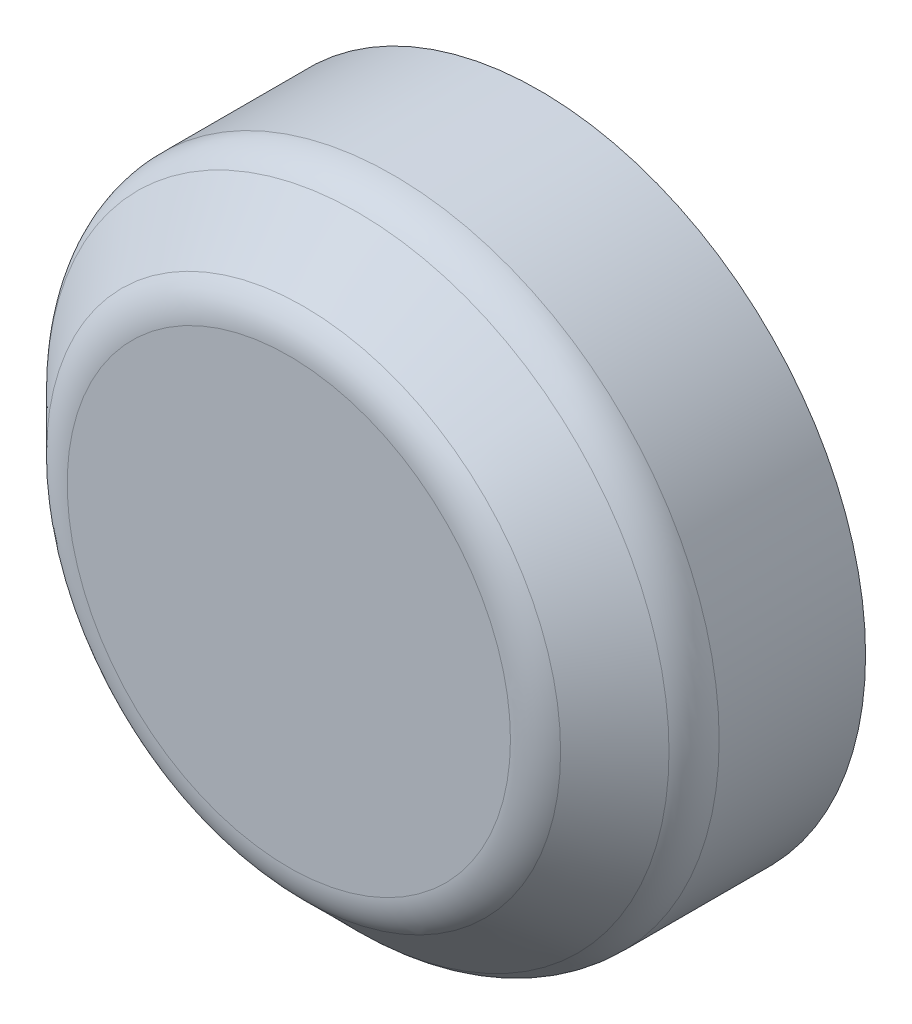
ISO-10303-21;
HEADER;
FILE_DESCRIPTION(('STEP AP214'),'2;1');
FILE_NAME('part.step','',(''),(''),'','','');
FILE_SCHEMA(('AUTOMOTIVE_DESIGN { 1 0 10303 214 1 1 1 1 }'));
ENDSEC;
DATA;
#1=APPLICATION_CONTEXT('core data for automotive mechanical design processes');
#2=APPLICATION_PROTOCOL_DEFINITION('international standard','automotive_design',2000,#1);
#3=PRODUCT_CONTEXT('',#1,'mechanical');
#4=PRODUCT('Part','Part','',(#3));
#5=PRODUCT_RELATED_PRODUCT_CATEGORY('part','',(#4));
#6=PRODUCT_DEFINITION_FORMATION('','',#4);
#7=PRODUCT_DEFINITION_CONTEXT('part definition',#1,'design');
#8=PRODUCT_DEFINITION('design','',#6,#7);
#9=PRODUCT_DEFINITION_SHAPE('','',#8);
#10=(LENGTH_UNIT() NAMED_UNIT(*) SI_UNIT(.MILLI.,.METRE.));
#11=(NAMED_UNIT(*) PLANE_ANGLE_UNIT() SI_UNIT($,.RADIAN.));
#12=(NAMED_UNIT(*) SI_UNIT($,.STERADIAN.) SOLID_ANGLE_UNIT());
#13=UNCERTAINTY_MEASURE_WITH_UNIT(LENGTH_MEASURE(1.E-05),#10,'distance_accuracy_value','');
#14=(GEOMETRIC_REPRESENTATION_CONTEXT(3) GLOBAL_UNCERTAINTY_ASSIGNED_CONTEXT((#13)) GLOBAL_UNIT_ASSIGNED_CONTEXT((#10,
#11,#12)) REPRESENTATION_CONTEXT('',''));
#15=CARTESIAN_POINT('',(0.,0.,0.));
#16=DIRECTION('',(0.,0.,1.));
#17=DIRECTION('',(1.,0.,0.));
#18=AXIS2_PLACEMENT_3D('',#15,#16,#17);
#19=CARTESIAN_POINT('',(0.,0.,15.));
#20=DIRECTION('',(0.,0.,-1.));
#21=DIRECTION('',(-1.,0.,0.));
#22=AXIS2_PLACEMENT_3D('',#19,#20,#21);
#23=CYLINDRICAL_SURFACE('',#22,19.5);
#24=CARTESIAN_POINT('',(0.,0.,8.75735931288069));
#25=DIRECTION('',(0.,0.,1.));
#26=DIRECTION('',(1.,0.,0.));
#27=AXIS2_PLACEMENT_3D('',#24,#25,#26);
#28=CIRCLE('',#27,19.5);
#29=CARTESIAN_POINT('',(19.5,0.,8.75735931288069));
#30=VERTEX_POINT('',#29);
#31=EDGE_CURVE('E70',#30,#30,#28,.F.);
#32=ORIENTED_EDGE('',*,*,#31,.T.);
#33=EDGE_LOOP('',(#32));
#34=FACE_BOUND('',#33,.T.);
#35=CARTESIAN_POINT('',(0.,0.,0.));
#36=DIRECTION('',(0.,0.,1.));
#37=DIRECTION('',(1.,0.,0.));
#38=AXIS2_PLACEMENT_3D('',#35,#36,#37);
#39=CIRCLE('',#38,19.5);
#40=CARTESIAN_POINT('',(19.5,0.,0.));
#41=VERTEX_POINT('',#40);
#42=EDGE_CURVE('E72',#41,#41,#39,.T.);
#43=ORIENTED_EDGE('',*,*,#42,.T.);
#44=EDGE_LOOP('',(#43));
#45=FACE_BOUND('',#44,.T.);
#46=ADVANCED_FACE('F39',(#34,#45),#23,.T.);
#47=CARTESIAN_POINT('',(0.,0.,15.));
#48=DIRECTION('',(0.,0.,1.));
#49=DIRECTION('',(1.,0.,0.));
#50=AXIS2_PLACEMENT_3D('',#47,#48,#49);
#51=PLANE('',#50);
#52=CARTESIAN_POINT('',(0.,0.,15.));
#53=DIRECTION('',(0.,0.,1.));
#54=DIRECTION('',(1.,0.,0.));
#55=AXIS2_PLACEMENT_3D('',#52,#53,#54);
#56=CIRCLE('',#55,13.2573593128807);
#57=CARTESIAN_POINT('',(13.2573593128807,0.,15.));
#58=VERTEX_POINT('',#57);
#59=EDGE_CURVE('E56',#58,#58,#56,.T.);
#60=ORIENTED_EDGE('',*,*,#59,.T.);
#61=EDGE_LOOP('',(#60));
#62=FACE_BOUND('',#61,.T.);
#63=ADVANCED_FACE('F100',(#62),#51,.T.);
#64=CARTESIAN_POINT('',(0.,0.,0.));
#65=DIRECTION('',(0.,0.,1.));
#66=DIRECTION('',(1.,0.,0.));
#67=AXIS2_PLACEMENT_3D('',#64,#65,#66);
#68=PLANE('',#67);
#69=CARTESIAN_POINT('',(0.,0.,0.));
#70=DIRECTION('',(0.,0.,1.));
#71=DIRECTION('',(1.,0.,0.));
#72=AXIS2_PLACEMENT_3D('',#69,#70,#71);
#73=CIRCLE('',#72,16.5);
#74=CARTESIAN_POINT('',(16.5,0.,0.));
#75=VERTEX_POINT('',#74);
#76=EDGE_CURVE('E74',#75,#75,#73,.T.);
#77=ORIENTED_EDGE('',*,*,#76,.T.);
#78=EDGE_LOOP('',(#77));
#79=FACE_BOUND('',#78,.T.);
#80=ORIENTED_EDGE('',*,*,#42,.F.);
#81=EDGE_LOOP('',(#80));
#82=FACE_BOUND('',#81,.T.);
#83=ADVANCED_FACE('F77',(#79,#82),#68,.F.);
#84=CARTESIAN_POINT('',(0.,0.,15.));
#85=DIRECTION('',(0.,0.,-1.));
#86=DIRECTION('',(-1.,0.,0.));
#87=AXIS2_PLACEMENT_3D('',#84,#85,#86);
#88=CONICAL_SURFACE('',#87,14.5,0.785398163397447);
#89=CARTESIAN_POINT('',(0.,0.,10.8786796564403));
#90=DIRECTION('',(0.,0.,-1.));
#91=DIRECTION('',(-1.,0.,0.));
#92=AXIS2_PLACEMENT_3D('',#89,#90,#91);
#93=CIRCLE('',#92,18.6213203435596);
#94=CARTESIAN_POINT('',(-18.6213203435596,0.,10.8786796564403));
#95=VERTEX_POINT('',#94);
#96=EDGE_CURVE('E64',#95,#95,#93,.F.);
#97=ORIENTED_EDGE('',*,*,#96,.T.);
#98=EDGE_LOOP('',(#97));
#99=FACE_BOUND('',#98,.T.);
#100=CARTESIAN_POINT('',(0.,0.,14.1213203435596));
#101=DIRECTION('',(0.,0.,1.));
#102=DIRECTION('',(1.,0.,0.));
#103=AXIS2_PLACEMENT_3D('',#100,#101,#102);
#104=CIRCLE('',#103,15.3786796564403);
#105=CARTESIAN_POINT('',(15.3786796564403,0.,14.1213203435596));
#106=VERTEX_POINT('',#105);
#107=EDGE_CURVE('E61',#106,#106,#104,.F.);
#108=ORIENTED_EDGE('',*,*,#107,.T.);
#109=EDGE_LOOP('',(#108));
#110=FACE_BOUND('',#109,.T.);
#111=ADVANCED_FACE('F108',(#99,#110),#88,.T.);
#112=CARTESIAN_POINT('',(0.,0.,8.75735931288069));
#113=DIRECTION('',(0.,0.,1.));
#114=DIRECTION('',(1.,0.,0.));
#115=AXIS2_PLACEMENT_3D('',#112,#113,#114);
#116=TOROIDAL_SURFACE('',#115,16.5,3.);
#117=ORIENTED_EDGE('',*,*,#96,.F.);
#118=EDGE_LOOP('',(#117));
#119=FACE_BOUND('',#118,.T.);
#120=ORIENTED_EDGE('',*,*,#31,.F.);
#121=EDGE_LOOP('',(#120));
#122=FACE_BOUND('',#121,.T.);
#123=ADVANCED_FACE('F91',(#119,#122),#116,.T.);
#124=CARTESIAN_POINT('',(0.,0.,12.));
#125=DIRECTION('',(0.,0.,1.));
#126=DIRECTION('',(1.,0.,0.));
#127=AXIS2_PLACEMENT_3D('',#124,#125,#126);
#128=TOROIDAL_SURFACE('',#127,13.2573593128807,3.);
#129=ORIENTED_EDGE('',*,*,#107,.F.);
#130=EDGE_LOOP('',(#129));
#131=FACE_BOUND('',#130,.T.);
#132=ORIENTED_EDGE('',*,*,#59,.F.);
#133=EDGE_LOOP('',(#132));
#134=FACE_BOUND('',#133,.T.);
#135=ADVANCED_FACE('F81',(#131,#134),#128,.T.);
#136=CARTESIAN_POINT('',(0.,0.,15.));
#137=DIRECTION('',(0.,0.,-1.));
#138=DIRECTION('',(-1.,0.,0.));
#139=AXIS2_PLACEMENT_3D('',#136,#137,#138);
#140=CYLINDRICAL_SURFACE('',#139,16.5);
#141=CARTESIAN_POINT('',(0.,0.,7.5147186257614));
#142=DIRECTION('',(0.,0.,-1.));
#143=DIRECTION('',(-1.,0.,0.));
#144=AXIS2_PLACEMENT_3D('',#141,#142,#143);
#145=CIRCLE('',#144,16.5);
#146=CARTESIAN_POINT('',(-16.5,0.,7.5147186257614));
#147=VERTEX_POINT('',#146);
#148=EDGE_CURVE('E46',#147,#147,#145,.F.);
#149=ORIENTED_EDGE('',*,*,#148,.T.);
#150=EDGE_LOOP('',(#149));
#151=FACE_BOUND('',#150,.T.);
#152=ORIENTED_EDGE('',*,*,#76,.F.);
#153=EDGE_LOOP('',(#152));
#154=FACE_BOUND('',#153,.T.);
#155=ADVANCED_FACE('F82',(#151,#154),#140,.F.);
#156=CARTESIAN_POINT('',(0.,0.,12.));
#157=DIRECTION('',(0.,0.,1.));
#158=DIRECTION('',(1.,0.,0.));
#159=AXIS2_PLACEMENT_3D('',#156,#157,#158);
#160=PLANE('',#159);
#161=CARTESIAN_POINT('',(0.,0.,12.));
#162=DIRECTION('',(0.,0.,1.));
#163=DIRECTION('',(1.,0.,0.));
#164=AXIS2_PLACEMENT_3D('',#161,#162,#163);
#165=CIRCLE('',#164,12.0147186257614);
#166=CARTESIAN_POINT('',(12.0147186257614,0.,12.));
#167=VERTEX_POINT('',#166);
#168=EDGE_CURVE('E10',#167,#167,#165,.F.);
#169=ORIENTED_EDGE('',*,*,#168,.T.);
#170=EDGE_LOOP('',(#169));
#171=FACE_BOUND('',#170,.T.);
#172=ADVANCED_FACE('F85',(#171),#160,.F.);
#173=CARTESIAN_POINT('',(0.,0.,12.8786796564404));
#174=DIRECTION('',(0.,0.,-1.));
#175=DIRECTION('',(-1.,0.,0.));
#176=AXIS2_PLACEMENT_3D('',#173,#174,#175);
#177=CONICAL_SURFACE('',#176,12.3786796564403,0.785398163397447);
#178=CARTESIAN_POINT('',(0.,0.,9.63603896932104));
#179=DIRECTION('',(0.,0.,1.));
#180=DIRECTION('',(1.,0.,0.));
#181=AXIS2_PLACEMENT_3D('',#178,#179,#180);
#182=CIRCLE('',#181,15.6213203435596);
#183=CARTESIAN_POINT('',(15.6213203435596,0.,9.63603896932104));
#184=VERTEX_POINT('',#183);
#185=EDGE_CURVE('E49',#184,#184,#182,.F.);
#186=ORIENTED_EDGE('',*,*,#185,.T.);
#187=EDGE_LOOP('',(#186));
#188=FACE_BOUND('',#187,.T.);
#189=CARTESIAN_POINT('',(0.,0.,11.1213203435596));
#190=DIRECTION('',(0.,0.,-1.));
#191=DIRECTION('',(-1.,0.,0.));
#192=AXIS2_PLACEMENT_3D('',#189,#190,#191);
#193=CIRCLE('',#192,14.1360389693211);
#194=CARTESIAN_POINT('',(-14.1360389693211,0.,11.1213203435596));
#195=VERTEX_POINT('',#194);
#196=EDGE_CURVE('E53',#195,#195,#193,.F.);
#197=ORIENTED_EDGE('',*,*,#196,.T.);
#198=EDGE_LOOP('',(#197));
#199=FACE_BOUND('',#198,.T.);
#200=ADVANCED_FACE('F89',(#188,#199),#177,.F.);
#201=CARTESIAN_POINT('',(0.,0.,7.5147186257614));
#202=DIRECTION('',(0.,0.,-1.));
#203=DIRECTION('',(-1.,0.,0.));
#204=AXIS2_PLACEMENT_3D('',#201,#202,#203);
#205=TOROIDAL_SURFACE('',#204,13.5,3.);
#206=ORIENTED_EDGE('',*,*,#148,.F.);
#207=EDGE_LOOP('',(#206));
#208=FACE_BOUND('',#207,.T.);
#209=ORIENTED_EDGE('',*,*,#185,.F.);
#210=EDGE_LOOP('',(#209));
#211=FACE_BOUND('',#210,.T.);
#212=ADVANCED_FACE('F119',(#208,#211),#205,.F.);
#213=CARTESIAN_POINT('',(0.,0.,9.));
#214=DIRECTION('',(0.,0.,1.));
#215=DIRECTION('',(1.,0.,0.));
#216=AXIS2_PLACEMENT_3D('',#213,#214,#215);
#217=TOROIDAL_SURFACE('',#216,12.0147186257614,3.);
#218=ORIENTED_EDGE('',*,*,#168,.F.);
#219=EDGE_LOOP('',(#218));
#220=FACE_BOUND('',#219,.T.);
#221=ORIENTED_EDGE('',*,*,#196,.F.);
#222=EDGE_LOOP('',(#221));
#223=FACE_BOUND('',#222,.T.);
#224=ADVANCED_FACE('F41',(#220,#223),#217,.F.);
#225=CLOSED_SHELL('',(#46,#63,#83,#111,#123,#135,#155,#172,#200,#212,#224));
#226=MANIFOLD_SOLID_BREP('B2',#225);
#227=ADVANCED_BREP_SHAPE_REPRESENTATION('',(#18,#226),#14);
#228=SHAPE_DEFINITION_REPRESENTATION(#9,#227);
ENDSEC;
END-ISO-10303-21;
